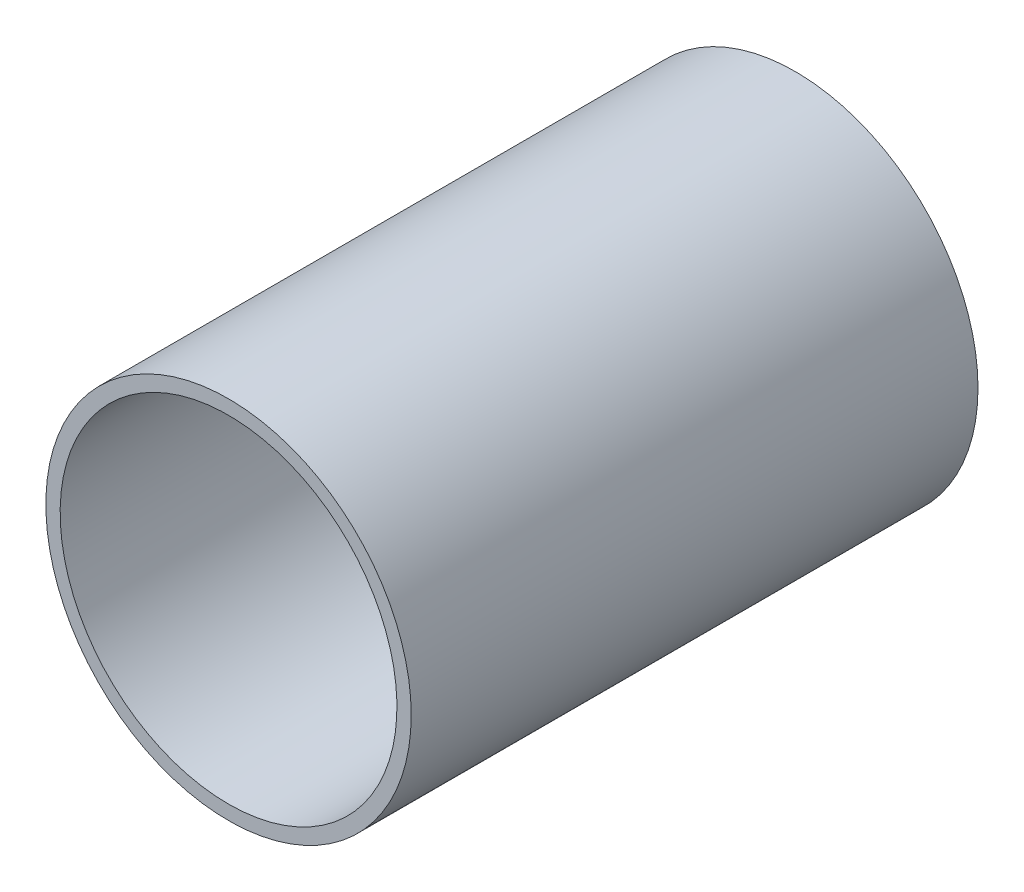
ISO-10303-21;
HEADER;
FILE_DESCRIPTION(('STEP AP214'),'2;1');
FILE_NAME('part.step','',(''),(''),'','','');
FILE_SCHEMA(('AUTOMOTIVE_DESIGN { 1 0 10303 214 1 1 1 1 }'));
ENDSEC;
DATA;
#1=APPLICATION_CONTEXT('core data for automotive mechanical design processes');
#2=APPLICATION_PROTOCOL_DEFINITION('international standard','automotive_design',2000,#1);
#3=PRODUCT_CONTEXT('',#1,'mechanical');
#4=PRODUCT('Part','Part','',(#3));
#5=PRODUCT_RELATED_PRODUCT_CATEGORY('part','',(#4));
#6=PRODUCT_DEFINITION_FORMATION('','',#4);
#7=PRODUCT_DEFINITION_CONTEXT('part definition',#1,'design');
#8=PRODUCT_DEFINITION('design','',#6,#7);
#9=PRODUCT_DEFINITION_SHAPE('','',#8);
#10=(LENGTH_UNIT() NAMED_UNIT(*) SI_UNIT(.MILLI.,.METRE.));
#11=(NAMED_UNIT(*) PLANE_ANGLE_UNIT() SI_UNIT($,.RADIAN.));
#12=(NAMED_UNIT(*) SI_UNIT($,.STERADIAN.) SOLID_ANGLE_UNIT());
#13=UNCERTAINTY_MEASURE_WITH_UNIT(LENGTH_MEASURE(1.E-05),#10,'distance_accuracy_value','');
#14=(GEOMETRIC_REPRESENTATION_CONTEXT(3) GLOBAL_UNCERTAINTY_ASSIGNED_CONTEXT((#13)) GLOBAL_UNIT_ASSIGNED_CONTEXT((#10,
#11,#12)) REPRESENTATION_CONTEXT('',''));
#15=CARTESIAN_POINT('',(0.,0.,0.));
#16=DIRECTION('',(0.,0.,1.));
#17=DIRECTION('',(1.,0.,0.));
#18=AXIS2_PLACEMENT_3D('',#15,#16,#17);
#19=CARTESIAN_POINT('',(1.48065448790646E-13,1.70419487612272E-13,10.1874999999998));
#20=DIRECTION('',(0.,0.,-1.));
#21=DIRECTION('',(0.99083420091764,-0.135083627031194,0.));
#22=AXIS2_PLACEMENT_3D('',#19,#20,#21);
#23=PLANE('',#22);
#24=CARTESIAN_POINT('',(1.48065448790646E-13,1.70419487612272E-13,10.1874999999998));
#25=DIRECTION('',(0.,0.,-1.));
#26=DIRECTION('',(0.99083420091764,-0.135083627031194,0.));
#27=AXIS2_PLACEMENT_3D('',#24,#25,#26);
#28=CIRCLE('',#27,28.575);
#29=CARTESIAN_POINT('',(28.3130872912217,-3.86001464241619,10.1874999999999));
#30=VERTEX_POINT('',#29);
#31=EDGE_CURVE('E64',#30,#30,#28,.T.);
#32=ORIENTED_EDGE('',*,*,#31,.F.);
#33=EDGE_LOOP('',(#32));
#34=FACE_BOUND('',#33,.T.);
#35=ADVANCED_FACE('F43',(#34),#23,.F.);
#36=CARTESIAN_POINT('',(-2.50312407369514E-06,-6.70710101443837E-07,96.1774999999998));
#37=DIRECTION('',(0.,0.,1.));
#38=DIRECTION('',(-0.478796796815294,0.877925752760115,0.));
#39=AXIS2_PLACEMENT_3D('',#36,#37,#38);
#40=PLANE('',#39);
#41=CARTESIAN_POINT('',(0.,1.00040399540503E-13,96.1774999999998));
#42=DIRECTION('',(0.,0.,1.));
#43=DIRECTION('',(-0.86351766655677,0.504318589330544,0.));
#44=AXIS2_PLACEMENT_3D('',#41,#42,#43);
#45=CIRCLE('',#44,28.575);
#46=CARTESIAN_POINT('',(-24.6750173218596,14.4109036901204,96.1774999999998));
#47=VERTEX_POINT('',#46);
#48=EDGE_CURVE('E61',#47,#47,#45,.F.);
#49=ORIENTED_EDGE('',*,*,#48,.T.);
#50=EDGE_LOOP('',(#49));
#51=FACE_BOUND('',#50,.T.);
#52=CARTESIAN_POINT('',(0.,0.,96.1774999999998));
#53=DIRECTION('',(0.,0.,1.));
#54=DIRECTION('',(1.,0.,0.));
#55=AXIS2_PLACEMENT_3D('',#52,#53,#54);
#56=CIRCLE('',#55,31.);
#57=CARTESIAN_POINT('',(31.,0.,96.1774999999998));
#58=VERTEX_POINT('',#57);
#59=EDGE_CURVE('E60',#58,#58,#56,.F.);
#60=ORIENTED_EDGE('',*,*,#59,.F.);
#61=EDGE_LOOP('',(#60));
#62=FACE_BOUND('',#61,.T.);
#63=ADVANCED_FACE('F131',(#51,#62),#40,.T.);
#64=CARTESIAN_POINT('',(0.,0.,315.7375));
#65=DIRECTION('',(0.,0.,-1.));
#66=DIRECTION('',(0.86351766655677,-0.504318589330544,0.));
#67=AXIS2_PLACEMENT_3D('',#64,#65,#66);
#68=CYLINDRICAL_SURFACE('',#67,28.575);
#69=ORIENTED_EDGE('',*,*,#48,.F.);
#70=EDGE_LOOP('',(#69));
#71=FACE_BOUND('',#70,.T.);
#72=ORIENTED_EDGE('',*,*,#31,.T.);
#73=EDGE_LOOP('',(#72));
#74=FACE_BOUND('',#73,.T.);
#75=ADVANCED_FACE('F142',(#71,#74),#68,.F.);
#76=CARTESIAN_POINT('',(0.,0.,190.82));
#77=DIRECTION('',(0.,0.,-1.));
#78=DIRECTION('',(-1.,0.,0.));
#79=AXIS2_PLACEMENT_3D('',#76,#77,#78);
#80=CYLINDRICAL_SURFACE('',#79,31.);
#81=CARTESIAN_POINT('',(0.,0.,0.));
#82=DIRECTION('',(0.,0.,1.));
#83=DIRECTION('',(1.,0.,0.));
#84=AXIS2_PLACEMENT_3D('',#81,#82,#83);
#85=CIRCLE('',#84,31.);
#86=CARTESIAN_POINT('',(31.,0.,0.));
#87=VERTEX_POINT('',#86);
#88=EDGE_CURVE('E10',#87,#87,#85,.T.);
#89=ORIENTED_EDGE('',*,*,#88,.T.);
#90=EDGE_LOOP('',(#89));
#91=FACE_BOUND('',#90,.T.);
#92=ORIENTED_EDGE('',*,*,#59,.T.);
#93=EDGE_LOOP('',(#92));
#94=FACE_BOUND('',#93,.T.);
#95=ADVANCED_FACE('F152',(#91,#94),#80,.T.);
#96=CARTESIAN_POINT('',(0.,0.,0.));
#97=DIRECTION('',(0.,0.,1.));
#98=DIRECTION('',(1.,0.,0.));
#99=AXIS2_PLACEMENT_3D('',#96,#97,#98);
#100=PLANE('',#99);
#101=ORIENTED_EDGE('',*,*,#88,.F.);
#102=EDGE_LOOP('',(#101));
#103=FACE_BOUND('',#102,.T.);
#104=ADVANCED_FACE('F159',(#103),#100,.F.);
#105=CLOSED_SHELL('',(#35,#63,#75,#95,#104));
#106=CARTESIAN_POINT('',(-1.38777878078145E-13,-1.11022302462516E-13,1.));
#107=DIRECTION('',(0.,0.,1.));
#108=DIRECTION('',(-0.399122469430708,-0.916897624817261,0.));
#109=AXIS2_PLACEMENT_3D('',#106,#107,#108);
#110=PLANE('',#109);
#111=CARTESIAN_POINT('',(-1.38777878078145E-13,-1.11022302462516E-13,1.));
#112=DIRECTION('',(0.,0.,1.));
#113=DIRECTION('',(-0.399122469430708,-0.916897624817261,0.));
#114=AXIS2_PLACEMENT_3D('',#111,#112,#113);
#115=CIRCLE('',#114,9.525);
#116=CARTESIAN_POINT('',(3.80164152132735,8.7334498763843,1.00000000000001));
#117=VERTEX_POINT('',#116);
#118=EDGE_CURVE('E66',#117,#117,#115,.T.);
#119=ORIENTED_EDGE('',*,*,#118,.T.);
#120=EDGE_LOOP('',(#119));
#121=FACE_BOUND('',#120,.T.);
#122=ADVANCED_FACE('F91',(#121),#110,.T.);
#123=CARTESIAN_POINT('',(-1.43496325932801E-13,-1.11451879248973E-13,6.));
#124=DIRECTION('',(0.,0.,-1.));
#125=DIRECTION('',(0.399122469430708,0.916897624817261,0.));
#126=AXIS2_PLACEMENT_3D('',#123,#124,#125);
#127=CYLINDRICAL_SURFACE('',#126,9.525);
#128=CARTESIAN_POINT('',(-1.43496325932801E-13,-1.11451879248973E-13,6.));
#129=DIRECTION('',(0.,0.,1.));
#130=DIRECTION('',(-0.399122469430708,-0.916897624817261,0.));
#131=AXIS2_PLACEMENT_3D('',#128,#129,#130);
#132=CIRCLE('',#131,9.525);
#133=CARTESIAN_POINT('',(3.80164152132735,8.7334498763843,6.));
#134=VERTEX_POINT('',#133);
#135=EDGE_CURVE('E69',#134,#134,#132,.T.);
#136=CARTESIAN_POINT('',(3.80164152132735,8.7334498763843,6.));
#137=CARTESIAN_POINT('',(3.80164152132735,8.7334498763843,5.94791666666667));
#138=CARTESIAN_POINT('',(3.80164152132735,8.7334498763843,5.89583333333334));
#139=CARTESIAN_POINT('',(3.80164152132735,8.7334498763843,5.79166666666667));
#140=CARTESIAN_POINT('',(3.80164152132735,8.7334498763843,5.73958333333334));
#141=CARTESIAN_POINT('',(3.80164152132735,8.7334498763843,5.63541666666667));
#142=CARTESIAN_POINT('',(3.80164152132735,8.7334498763843,5.58333333333334));
#143=CARTESIAN_POINT('',(3.80164152132735,8.7334498763843,5.47916666666667));
#144=CARTESIAN_POINT('',(3.80164152132735,8.7334498763843,5.42708333333334));
#145=CARTESIAN_POINT('',(3.80164152132735,8.7334498763843,5.32291666666667));
#146=CARTESIAN_POINT('',(3.80164152132735,8.7334498763843,5.27083333333334));
#147=CARTESIAN_POINT('',(3.80164152132735,8.7334498763843,5.16666666666667));
#148=CARTESIAN_POINT('',(3.80164152132735,8.7334498763843,5.11458333333334));
#149=CARTESIAN_POINT('',(3.80164152132735,8.7334498763843,5.01041666666667));
#150=CARTESIAN_POINT('',(3.80164152132735,8.7334498763843,4.95833333333334));
#151=CARTESIAN_POINT('',(3.80164152132735,8.7334498763843,4.85416666666667));
#152=CARTESIAN_POINT('',(3.80164152132735,8.7334498763843,4.80208333333334));
#153=CARTESIAN_POINT('',(3.80164152132735,8.7334498763843,4.69791666666667));
#154=CARTESIAN_POINT('',(3.80164152132735,8.7334498763843,4.64583333333334));
#155=CARTESIAN_POINT('',(3.80164152132735,8.7334498763843,4.54166666666667));
#156=CARTESIAN_POINT('',(3.80164152132735,8.7334498763843,4.48958333333334));
#157=CARTESIAN_POINT('',(3.80164152132735,8.7334498763843,4.38541666666667));
#158=CARTESIAN_POINT('',(3.80164152132735,8.7334498763843,4.33333333333334));
#159=CARTESIAN_POINT('',(3.80164152132735,8.7334498763843,4.22916666666667));
#160=CARTESIAN_POINT('',(3.80164152132735,8.7334498763843,4.17708333333334));
#161=CARTESIAN_POINT('',(3.80164152132735,8.7334498763843,4.07291666666667));
#162=CARTESIAN_POINT('',(3.80164152132735,8.7334498763843,4.02083333333334));
#163=CARTESIAN_POINT('',(3.80164152132735,8.7334498763843,3.91666666666667));
#164=CARTESIAN_POINT('',(3.80164152132735,8.7334498763843,3.86458333333334));
#165=CARTESIAN_POINT('',(3.80164152132735,8.7334498763843,3.76041666666667));
#166=CARTESIAN_POINT('',(3.80164152132735,8.7334498763843,3.70833333333334));
#167=CARTESIAN_POINT('',(3.80164152132735,8.7334498763843,3.60416666666667));
#168=CARTESIAN_POINT('',(3.80164152132735,8.7334498763843,3.55208333333334));
#169=CARTESIAN_POINT('',(3.80164152132735,8.7334498763843,3.44791666666667));
#170=CARTESIAN_POINT('',(3.80164152132735,8.7334498763843,3.39583333333334));
#171=CARTESIAN_POINT('',(3.80164152132735,8.7334498763843,3.29166666666667));
#172=CARTESIAN_POINT('',(3.80164152132735,8.7334498763843,3.23958333333334));
#173=CARTESIAN_POINT('',(3.80164152132735,8.7334498763843,3.13541666666667));
#174=CARTESIAN_POINT('',(3.80164152132735,8.7334498763843,3.08333333333334));
#175=CARTESIAN_POINT('',(3.80164152132735,8.7334498763843,2.97916666666667));
#176=CARTESIAN_POINT('',(3.80164152132735,8.7334498763843,2.92708333333334));
#177=CARTESIAN_POINT('',(3.80164152132735,8.7334498763843,2.82291666666667));
#178=CARTESIAN_POINT('',(3.80164152132735,8.7334498763843,2.77083333333334));
#179=CARTESIAN_POINT('',(3.80164152132735,8.7334498763843,2.66666666666667));
#180=CARTESIAN_POINT('',(3.80164152132735,8.7334498763843,2.61458333333334));
#181=CARTESIAN_POINT('',(3.80164152132735,8.7334498763843,2.51041666666667));
#182=CARTESIAN_POINT('',(3.80164152132735,8.7334498763843,2.45833333333334));
#183=CARTESIAN_POINT('',(3.80164152132735,8.7334498763843,2.35416666666667));
#184=CARTESIAN_POINT('',(3.80164152132735,8.7334498763843,2.30208333333334));
#185=CARTESIAN_POINT('',(3.80164152132735,8.7334498763843,2.19791666666667));
#186=CARTESIAN_POINT('',(3.80164152132735,8.7334498763843,2.14583333333334));
#187=CARTESIAN_POINT('',(3.80164152132735,8.7334498763843,2.04166666666667));
#188=CARTESIAN_POINT('',(3.80164152132735,8.7334498763843,1.98958333333334));
#189=CARTESIAN_POINT('',(3.80164152132735,8.7334498763843,1.88541666666667));
#190=CARTESIAN_POINT('',(3.80164152132735,8.7334498763843,1.83333333333334));
#191=CARTESIAN_POINT('',(3.80164152132735,8.7334498763843,1.72916666666667));
#192=CARTESIAN_POINT('',(3.80164152132735,8.7334498763843,1.67708333333334));
#193=CARTESIAN_POINT('',(3.80164152132735,8.7334498763843,1.57291666666667));
#194=CARTESIAN_POINT('',(3.80164152132735,8.7334498763843,1.52083333333334));
#195=CARTESIAN_POINT('',(3.80164152132735,8.7334498763843,1.41666666666667));
#196=CARTESIAN_POINT('',(3.80164152132735,8.7334498763843,1.36458333333334));
#197=CARTESIAN_POINT('',(3.80164152132735,8.7334498763843,1.26041666666667));
#198=CARTESIAN_POINT('',(3.80164152132735,8.7334498763843,1.20833333333334));
#199=CARTESIAN_POINT('',(3.80164152132735,8.7334498763843,1.10416666666667));
#200=CARTESIAN_POINT('',(3.80164152132735,8.7334498763843,1.05208333333334));
#201=CARTESIAN_POINT('',(3.80164152132735,8.7334498763843,1.00000000000001));
#202=B_SPLINE_CURVE_WITH_KNOTS('',3,(#136,#137,#138,#139,#140,#141,#142,#143,#144,#145,#146,
#147,#148,#149,#150,#151,#152,#153,#154,#155,#156,#157,#158,#159,#160,#161,#162,#163,#164,#165,
#166,#167,#168,#169,#170,#171,#172,#173,#174,#175,#176,#177,#178,#179,#180,#181,#182,#183,#184,
#185,#186,#187,#188,#189,#190,#191,#192,#193,#194,#195,#196,#197,#198,#199,#200,#201),
.UNSPECIFIED.,.F.,.F.,(4,2,2,2,2,2,2,2,2,2,2,2,2,2,2,2,2,2,2,2,2,2,2,2,2,2,2,2,2,2,2,2,4),(0.,
0.156249999999999,0.312499999999999,0.46875,0.625,0.781249999999999,0.937499999999999,1.09375,
1.25,1.40625,1.5625,1.71875,1.875,2.03125,2.1875,2.34375,2.5,2.65625,2.8125,2.96875,3.125,
3.28125,3.4375,3.59375,3.75,3.90625,4.0625,4.21875,4.375,4.53125,4.6875,4.84375,5.),.UNSPECIFIED.);
#203=EDGE_CURVE('BSEAM89',#134,#117,#202,.T.);
#204=ORIENTED_EDGE('',*,*,#135,.T.);
#205=ORIENTED_EDGE('',*,*,#118,.F.);
#206=ORIENTED_EDGE('',*,*,#203,.T.);
#207=ORIENTED_EDGE('',*,*,#203,.F.);
#208=EDGE_LOOP('',(#204,#206,#205,#207));
#209=FACE_BOUND('',#208,.T.);
#210=ADVANCED_FACE('F89',(#209),#127,.F.);
#211=CARTESIAN_POINT('',(-1.43496325932801E-13,-1.11451879248973E-13,6.));
#212=DIRECTION('',(0.,0.,1.));
#213=DIRECTION('',(-0.399122469430708,-0.916897624817261,0.));
#214=AXIS2_PLACEMENT_3D('',#211,#212,#213);
#215=PLANE('',#214);
#216=ORIENTED_EDGE('',*,*,#135,.F.);
#217=EDGE_LOOP('',(#216));
#218=FACE_BOUND('',#217,.T.);
#219=CARTESIAN_POINT('',(-1.43496325932801E-13,-1.11451879248973E-13,6.));
#220=DIRECTION('',(0.,0.,1.));
#221=DIRECTION('',(-0.399122469430708,-0.916897624817261,0.));
#222=AXIS2_PLACEMENT_3D('',#219,#220,#221);
#223=CIRCLE('',#222,25.4);
#224=CARTESIAN_POINT('',(-24.1860811006085,-7.75844578474294,5.99999999999998));
#225=VERTEX_POINT('',#224);
#226=EDGE_CURVE('E47',#225,#225,#223,.T.);
#227=ORIENTED_EDGE('',*,*,#226,.T.);
#228=EDGE_LOOP('',(#227));
#229=FACE_BOUND('',#228,.T.);
#230=ADVANCED_FACE('F45',(#218,#229),#215,.T.);
#231=CARTESIAN_POINT('',(-1.3773981955012E-13,-1.11567013219777E-13,6.74999999999997));
#232=DIRECTION('',(0.,0.,1.));
#233=DIRECTION('',(-0.952207917346787,-0.305450621446568,0.));
#234=AXIS2_PLACEMENT_3D('',#231,#232,#233);
#235=CYLINDRICAL_SURFACE('',#234,25.4);
#236=CARTESIAN_POINT('',(-1.3924972286361E-13,-1.10774706663761E-13,8.34999999999997));
#237=DIRECTION('',(0.,0.,1.));
#238=DIRECTION('',(-0.952207917346787,-0.305450621446568,0.));
#239=AXIS2_PLACEMENT_3D('',#236,#237,#238);
#240=CIRCLE('',#239,25.4);
#241=CARTESIAN_POINT('',(-24.1860811006085,-7.75844578474294,8.34999999999995));
#242=VERTEX_POINT('',#241);
#243=EDGE_CURVE('E52',#242,#242,#240,.T.);
#244=CARTESIAN_POINT('',(-24.1860811006085,-7.75844578474294,8.34999999999995));
#245=CARTESIAN_POINT('',(-24.1860811006085,-7.75844578474294,8.32552083333328));
#246=CARTESIAN_POINT('',(-24.1860811006085,-7.75844578474294,8.30104166666662));
#247=CARTESIAN_POINT('',(-24.1860811006085,-7.75844578474294,8.25208333333329));
#248=CARTESIAN_POINT('',(-24.1860811006085,-7.75844578474294,8.22760416666662));
#249=CARTESIAN_POINT('',(-24.1860811006085,-7.75844578474294,8.17864583333329));
#250=CARTESIAN_POINT('',(-24.1860811006085,-7.75844578474294,8.15416666666662));
#251=CARTESIAN_POINT('',(-24.1860811006085,-7.75844578474294,8.10520833333329));
#252=CARTESIAN_POINT('',(-24.1860811006085,-7.75844578474294,8.08072916666662));
#253=CARTESIAN_POINT('',(-24.1860811006085,-7.75844578474294,8.03177083333329));
#254=CARTESIAN_POINT('',(-24.1860811006085,-7.75844578474294,8.00729166666662));
#255=CARTESIAN_POINT('',(-24.1860811006085,-7.75844578474294,7.95833333333329));
#256=CARTESIAN_POINT('',(-24.1860811006085,-7.75844578474294,7.93385416666662));
#257=CARTESIAN_POINT('',(-24.1860811006085,-7.75844578474294,7.88489583333329));
#258=CARTESIAN_POINT('',(-24.1860811006085,-7.75844578474294,7.86041666666662));
#259=CARTESIAN_POINT('',(-24.1860811006085,-7.75844578474294,7.81145833333329));
#260=CARTESIAN_POINT('',(-24.1860811006085,-7.75844578474294,7.78697916666662));
#261=CARTESIAN_POINT('',(-24.1860811006085,-7.75844578474294,7.73802083333329));
#262=CARTESIAN_POINT('',(-24.1860811006085,-7.75844578474294,7.71354166666662));
#263=CARTESIAN_POINT('',(-24.1860811006085,-7.75844578474294,7.66458333333329));
#264=CARTESIAN_POINT('',(-24.1860811006085,-7.75844578474294,7.64010416666662));
#265=CARTESIAN_POINT('',(-24.1860811006085,-7.75844578474294,7.59114583333329));
#266=CARTESIAN_POINT('',(-24.1860811006085,-7.75844578474294,7.56666666666663));
#267=CARTESIAN_POINT('',(-24.1860811006085,-7.75844578474294,7.51770833333329));
#268=CARTESIAN_POINT('',(-24.1860811006085,-7.75844578474294,7.49322916666663));
#269=CARTESIAN_POINT('',(-24.1860811006085,-7.75844578474294,7.44427083333329));
#270=CARTESIAN_POINT('',(-24.1860811006085,-7.75844578474294,7.41979166666663));
#271=CARTESIAN_POINT('',(-24.1860811006085,-7.75844578474294,7.37083333333329));
#272=CARTESIAN_POINT('',(-24.1860811006085,-7.75844578474294,7.34635416666663));
#273=CARTESIAN_POINT('',(-24.1860811006085,-7.75844578474294,7.2973958333333));
#274=CARTESIAN_POINT('',(-24.1860811006085,-7.75844578474294,7.27291666666663));
#275=CARTESIAN_POINT('',(-24.1860811006085,-7.75844578474294,7.2239583333333));
#276=CARTESIAN_POINT('',(-24.1860811006085,-7.75844578474294,7.19947916666663));
#277=CARTESIAN_POINT('',(-24.1860811006085,-7.75844578474294,7.1505208333333));
#278=CARTESIAN_POINT('',(-24.1860811006085,-7.75844578474294,7.12604166666663));
#279=CARTESIAN_POINT('',(-24.1860811006085,-7.75844578474294,7.0770833333333));
#280=CARTESIAN_POINT('',(-24.1860811006085,-7.75844578474294,7.05260416666663));
#281=CARTESIAN_POINT('',(-24.1860811006085,-7.75844578474294,7.0036458333333));
#282=CARTESIAN_POINT('',(-24.1860811006085,-7.75844578474294,6.97916666666663));
#283=CARTESIAN_POINT('',(-24.1860811006085,-7.75844578474294,6.9302083333333));
#284=CARTESIAN_POINT('',(-24.1860811006085,-7.75844578474294,6.90572916666663));
#285=CARTESIAN_POINT('',(-24.1860811006085,-7.75844578474294,6.8567708333333));
#286=CARTESIAN_POINT('',(-24.1860811006085,-7.75844578474294,6.83229166666663));
#287=CARTESIAN_POINT('',(-24.1860811006085,-7.75844578474294,6.7833333333333));
#288=CARTESIAN_POINT('',(-24.1860811006085,-7.75844578474294,6.75885416666664));
#289=CARTESIAN_POINT('',(-24.1860811006085,-7.75844578474294,6.7098958333333));
#290=CARTESIAN_POINT('',(-24.1860811006085,-7.75844578474294,6.68541666666664));
#291=CARTESIAN_POINT('',(-24.1860811006085,-7.75844578474294,6.6364583333333));
#292=CARTESIAN_POINT('',(-24.1860811006085,-7.75844578474294,6.61197916666664));
#293=CARTESIAN_POINT('',(-24.1860811006085,-7.75844578474294,6.5630208333333));
#294=CARTESIAN_POINT('',(-24.1860811006085,-7.75844578474294,6.53854166666664));
#295=CARTESIAN_POINT('',(-24.1860811006085,-7.75844578474294,6.4895833333333));
#296=CARTESIAN_POINT('',(-24.1860811006085,-7.75844578474294,6.46510416666664));
#297=CARTESIAN_POINT('',(-24.1860811006085,-7.75844578474294,6.4161458333333));
#298=CARTESIAN_POINT('',(-24.1860811006085,-7.75844578474294,6.39166666666664));
#299=CARTESIAN_POINT('',(-24.1860811006085,-7.75844578474294,6.34270833333331));
#300=CARTESIAN_POINT('',(-24.1860811006085,-7.75844578474294,6.31822916666664));
#301=CARTESIAN_POINT('',(-24.1860811006085,-7.75844578474294,6.26927083333331));
#302=CARTESIAN_POINT('',(-24.1860811006085,-7.75844578474294,6.24479166666664));
#303=CARTESIAN_POINT('',(-24.1860811006085,-7.75844578474294,6.19583333333331));
#304=CARTESIAN_POINT('',(-24.1860811006085,-7.75844578474294,6.17135416666664));
#305=CARTESIAN_POINT('',(-24.1860811006085,-7.75844578474294,6.12239583333331));
#306=CARTESIAN_POINT('',(-24.1860811006085,-7.75844578474294,6.09791666666664));
#307=CARTESIAN_POINT('',(-24.1860811006085,-7.75844578474294,6.04895833333331));
#308=CARTESIAN_POINT('',(-24.1860811006085,-7.75844578474294,6.02447916666664));
#309=CARTESIAN_POINT('',(-24.1860811006085,-7.75844578474294,5.99999999999998));
#310=B_SPLINE_CURVE_WITH_KNOTS('',3,(#244,#245,#246,#247,#248,#249,#250,#251,#252,#253,#254,
#255,#256,#257,#258,#259,#260,#261,#262,#263,#264,#265,#266,#267,#268,#269,#270,#271,#272,#273,
#274,#275,#276,#277,#278,#279,#280,#281,#282,#283,#284,#285,#286,#287,#288,#289,#290,#291,#292,
#293,#294,#295,#296,#297,#298,#299,#300,#301,#302,#303,#304,#305,#306,#307,#308,#309),
.UNSPECIFIED.,.F.,.F.,(4,2,2,2,2,2,2,2,2,2,2,2,2,2,2,2,2,2,2,2,2,2,2,2,2,2,2,2,2,2,2,2,4),(0.,
0.0734375000000006,0.146874999999999,0.220312499999998,0.293749999999997,0.367187499999996,
0.440624999999997,0.514062499999995,0.587499999999994,0.660937499999993,0.734374999999993,
0.807812499999992,0.881249999999991,0.95468749999999,1.02812499999999,1.10156249999999,
1.17499999999999,1.24843749999999,1.32187499999999,1.39531249999999,1.46874999999998,
1.54218749999998,1.61562499999998,1.68906249999998,1.76249999999998,1.83593749999998,
1.90937499999998,1.98281249999998,2.05624999999998,2.12968749999998,2.20312499999998,
2.27656249999998,2.34999999999997),.UNSPECIFIED.);
#311=EDGE_CURVE('BSEAM77',#242,#225,#310,.T.);
#312=ORIENTED_EDGE('',*,*,#243,.T.);
#313=ORIENTED_EDGE('',*,*,#226,.F.);
#314=ORIENTED_EDGE('',*,*,#311,.T.);
#315=ORIENTED_EDGE('',*,*,#311,.F.);
#316=EDGE_LOOP('',(#312,#314,#313,#315));
#317=FACE_BOUND('',#316,.T.);
#318=ADVANCED_FACE('F77',(#317),#235,.F.);
#319=CARTESIAN_POINT('',(-1.3924972286361E-13,-1.10774706663761E-13,8.34999999999997));
#320=DIRECTION('',(0.,0.,1.));
#321=DIRECTION('',(-0.952207917346787,-0.305450621446568,0.));
#322=AXIS2_PLACEMENT_3D('',#319,#320,#321);
#323=PLANE('',#322);
#324=ORIENTED_EDGE('',*,*,#243,.F.);
#325=EDGE_LOOP('',(#324));
#326=FACE_BOUND('',#325,.T.);
#327=ADVANCED_FACE('F79',(#326),#323,.F.);
#328=CLOSED_SHELL('',(#122,#210,#230,#318,#327));
#329=ORIENTED_CLOSED_SHELL('',*,#328,.T.);
#330=BREP_WITH_VOIDS('B2',#105,(#329));
#331=ADVANCED_BREP_SHAPE_REPRESENTATION('',(#18,#330),#14);
#332=SHAPE_DEFINITION_REPRESENTATION(#9,#331);
ENDSEC;
END-ISO-10303-21;
